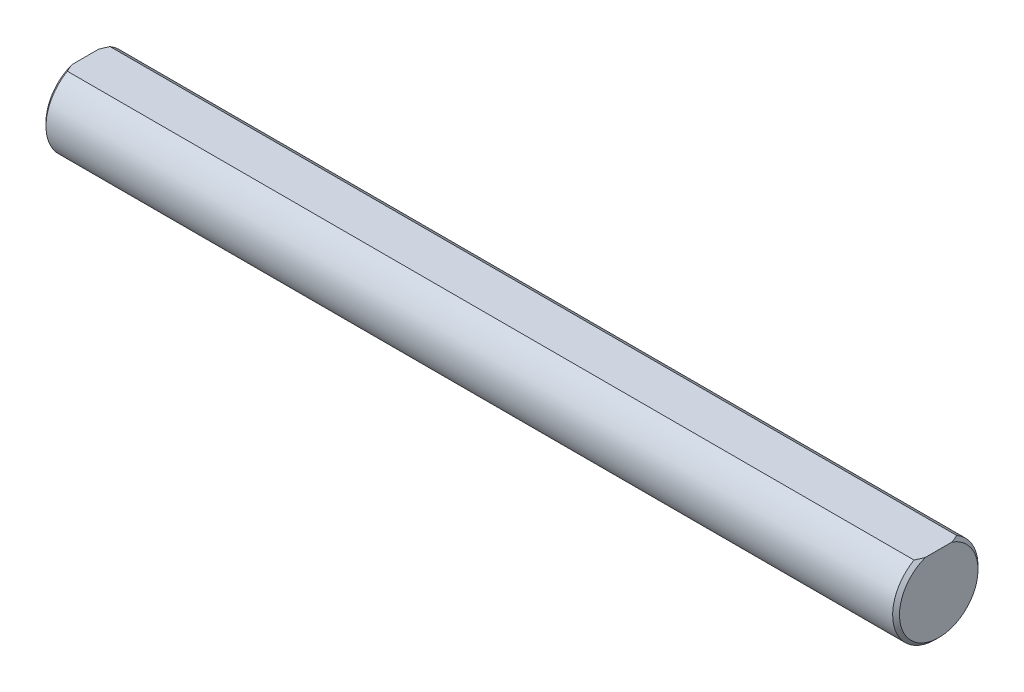
ISO-10303-21;
HEADER;
FILE_DESCRIPTION(('STEP AP214'),'2;1');
FILE_NAME('part.step','',(''),(''),'','','');
FILE_SCHEMA(('AUTOMOTIVE_DESIGN { 1 0 10303 214 1 1 1 1 }'));
ENDSEC;
DATA;
#1=APPLICATION_CONTEXT('core data for automotive mechanical design processes');
#2=APPLICATION_PROTOCOL_DEFINITION('international standard','automotive_design',2000,#1);
#3=PRODUCT_CONTEXT('',#1,'mechanical');
#4=PRODUCT('Part','Part','',(#3));
#5=PRODUCT_RELATED_PRODUCT_CATEGORY('part','',(#4));
#6=PRODUCT_DEFINITION_FORMATION('','',#4);
#7=PRODUCT_DEFINITION_CONTEXT('part definition',#1,'design');
#8=PRODUCT_DEFINITION('design','',#6,#7);
#9=PRODUCT_DEFINITION_SHAPE('','',#8);
#10=(LENGTH_UNIT() NAMED_UNIT(*) SI_UNIT(.MILLI.,.METRE.));
#11=(NAMED_UNIT(*) PLANE_ANGLE_UNIT() SI_UNIT($,.RADIAN.));
#12=(NAMED_UNIT(*) SI_UNIT($,.STERADIAN.) SOLID_ANGLE_UNIT());
#13=UNCERTAINTY_MEASURE_WITH_UNIT(LENGTH_MEASURE(1.E-05),#10,'distance_accuracy_value','');
#14=(GEOMETRIC_REPRESENTATION_CONTEXT(3) GLOBAL_UNCERTAINTY_ASSIGNED_CONTEXT((#13)) GLOBAL_UNIT_ASSIGNED_CONTEXT((#10,
#11,#12)) REPRESENTATION_CONTEXT('',''));
#15=CARTESIAN_POINT('',(0.,0.,0.));
#16=DIRECTION('',(0.,0.,1.));
#17=DIRECTION('',(1.,0.,0.));
#18=AXIS2_PLACEMENT_3D('',#15,#16,#17);
#19=CARTESIAN_POINT('',(63.5,0.,0.));
#20=DIRECTION('',(-1.,0.,0.));
#21=DIRECTION('',(0.,0.,-1.));
#22=AXIS2_PLACEMENT_3D('',#19,#20,#21);
#23=CYLINDRICAL_SURFACE('',#22,3.175);
#24=CARTESIAN_POINT('',(63.246,0.,0.));
#25=DIRECTION('',(-1.,0.,0.));
#26=DIRECTION('',(0.,0.,1.));
#27=AXIS2_PLACEMENT_3D('',#24,#25,#26);
#28=CIRCLE('',#27,3.175);
#29=CARTESIAN_POINT('',(63.246,2.74963065701559,1.5875));
#30=VERTEX_POINT('',#29);
#31=CARTESIAN_POINT('',(63.246,2.74963065701559,-1.5875));
#32=VERTEX_POINT('',#31);
#33=EDGE_CURVE('E102',#30,#32,#28,.F.);
#34=ORIENTED_EDGE('',*,*,#33,.F.);
#35=DIRECTION('',(1.,0.,0.));
#36=VECTOR('',#35,1.);
#37=CARTESIAN_POINT('',(0.,2.74963065701559,1.5875));
#38=LINE('',#37,#36);
#39=CARTESIAN_POINT('',(0.25399999999999,2.74963065701559,1.5875));
#40=VERTEX_POINT('',#39);
#41=EDGE_CURVE('E114',#40,#30,#38,.T.);
#42=ORIENTED_EDGE('',*,*,#41,.F.);
#43=CARTESIAN_POINT('',(0.25399999999999,0.,0.));
#44=DIRECTION('',(-1.,0.,0.));
#45=DIRECTION('',(0.,0.,1.));
#46=AXIS2_PLACEMENT_3D('',#43,#44,#45);
#47=CIRCLE('',#46,3.175);
#48=CARTESIAN_POINT('',(0.25399999999999,2.74963065701559,-1.5875));
#49=VERTEX_POINT('',#48);
#50=EDGE_CURVE('E93',#49,#40,#47,.T.);
#51=ORIENTED_EDGE('',*,*,#50,.F.);
#52=DIRECTION('',(1.,0.,0.));
#53=VECTOR('',#52,1.);
#54=CARTESIAN_POINT('',(0.,2.74963065701559,-1.5875));
#55=LINE('',#54,#53);
#56=EDGE_CURVE('E98',#49,#32,#55,.T.);
#57=ORIENTED_EDGE('',*,*,#56,.T.);
#58=EDGE_LOOP('',(#34,#42,#51,#57));
#59=FACE_BOUND('',#58,.T.);
#60=ADVANCED_FACE('F43',(#59),#23,.T.);
#61=CARTESIAN_POINT('',(63.5,0.,0.));
#62=DIRECTION('',(1.,0.,0.));
#63=DIRECTION('',(0.,0.,1.));
#64=AXIS2_PLACEMENT_3D('',#61,#62,#63);
#65=PLANE('',#64);
#66=DIRECTION('',(0.,0.,1.));
#67=VECTOR('',#66,1.);
#68=CARTESIAN_POINT('',(63.5,2.74963065701559,-1.5875));
#69=LINE('',#68,#67);
#70=CARTESIAN_POINT('',(63.5,2.74963065701559,-0.98578509321245));
#71=VERTEX_POINT('',#70);
#72=CARTESIAN_POINT('',(63.5,2.74963065701559,0.98578509321245));
#73=VERTEX_POINT('',#72);
#74=EDGE_CURVE('E99',#71,#73,#69,.T.);
#75=ORIENTED_EDGE('',*,*,#74,.T.);
#76=CARTESIAN_POINT('',(63.5,0.,0.));
#77=DIRECTION('',(-1.,0.,0.));
#78=DIRECTION('',(0.,0.,1.));
#79=AXIS2_PLACEMENT_3D('',#76,#77,#78);
#80=CIRCLE('',#79,2.92099999999998);
#81=EDGE_CURVE('E106',#71,#73,#80,.T.);
#82=ORIENTED_EDGE('',*,*,#81,.F.);
#83=EDGE_LOOP('',(#75,#82));
#84=FACE_BOUND('',#83,.T.);
#85=ADVANCED_FACE('F124',(#84),#65,.T.);
#86=CARTESIAN_POINT('',(0.,0.,0.));
#87=DIRECTION('',(1.,0.,0.));
#88=DIRECTION('',(0.,0.,1.));
#89=AXIS2_PLACEMENT_3D('',#86,#87,#88);
#90=PLANE('',#89);
#91=CARTESIAN_POINT('',(0.,0.,0.));
#92=DIRECTION('',(-1.,0.,0.));
#93=DIRECTION('',(0.,0.,1.));
#94=AXIS2_PLACEMENT_3D('',#91,#92,#93);
#95=CIRCLE('',#94,2.92100000000001);
#96=CARTESIAN_POINT('',(0.,2.74963065701559,0.985785093212533));
#97=VERTEX_POINT('',#96);
#98=CARTESIAN_POINT('',(0.,2.74963065701559,-0.985785093212533));
#99=VERTEX_POINT('',#98);
#100=EDGE_CURVE('E91',#97,#99,#95,.F.);
#101=ORIENTED_EDGE('',*,*,#100,.F.);
#102=DIRECTION('',(0.,0.,1.));
#103=VECTOR('',#102,1.);
#104=CARTESIAN_POINT('',(0.,2.74963065701559,-1.5875));
#105=LINE('',#104,#103);
#106=EDGE_CURVE('E95',#99,#97,#105,.T.);
#107=ORIENTED_EDGE('',*,*,#106,.F.);
#108=EDGE_LOOP('',(#101,#107));
#109=FACE_BOUND('',#108,.T.);
#110=ADVANCED_FACE('F101',(#109),#90,.F.);
#111=CARTESIAN_POINT('',(63.5,0.,0.));
#112=DIRECTION('',(-1.,0.,0.));
#113=DIRECTION('',(0.,0.,-1.));
#114=AXIS2_PLACEMENT_3D('',#111,#112,#113);
#115=CONICAL_SURFACE('',#114,2.92099999999998,0.785398163397426);
#116=CARTESIAN_POINT('',(63.2456499421323,2.74963065701559,-1.5882));
#117=CARTESIAN_POINT('',(63.3001996989638,2.74963065701559,-1.47903148983546));
#118=CARTESIAN_POINT('',(63.3515467736487,2.74963065701559,-1.36803725312433));
#119=CARTESIAN_POINT('',(63.4455640164844,2.74963065701559,-1.14170613856966));
#120=CARTESIAN_POINT('',(63.4881818395587,2.74963065701559,-1.02634771127011));
#121=CARTESIAN_POINT('',(63.561188105863,2.74963065701559,-0.793732645811769));
#122=CARTESIAN_POINT('',(63.5917601474436,2.74963065701559,-0.676535314799173));
#123=CARTESIAN_POINT('',(63.6388637626289,2.74963065701559,-0.439559207905062));
#124=CARTESIAN_POINT('',(63.6554305251547,2.74963065701559,-0.319787681762728));
#125=CARTESIAN_POINT('',(63.6703772767312,2.74963065701559,-0.113390763403446));
#126=CARTESIAN_POINT('',(63.6725911723138,2.74963065701559,-0.0270323810888239));
#127=CARTESIAN_POINT('',(63.6688706827955,2.74963065701559,0.145543469555141));
#128=CARTESIAN_POINT('',(63.6629334400268,2.74963065701559,0.231760877849797));
#129=CARTESIAN_POINT('',(63.643248527632,2.74963065701559,0.403381872739535));
#130=CARTESIAN_POINT('',(63.6294921121184,2.74963065701559,0.48878443897258));
#131=CARTESIAN_POINT('',(63.5949240312319,2.74963065701559,0.658112847485047));
#132=CARTESIAN_POINT('',(63.5741129063332,2.74963065701559,0.742038802372403));
#133=CARTESIAN_POINT('',(63.51230417238,2.74963065701559,0.957097052575754));
#134=CARTESIAN_POINT('',(63.4666386107287,2.74963065701559,1.08689353852323));
#135=CARTESIAN_POINT('',(63.389545010794,2.74963065701559,1.27774543186099));
#136=CARTESIAN_POINT('',(63.362457262408,2.74963065701559,1.3406393035772));
#137=CARTESIAN_POINT('',(63.3058118782309,2.74963065701559,1.46526121960738));
#138=CARTESIAN_POINT('',(63.2762557633007,2.74963065701559,1.52698995347894));
#139=CARTESIAN_POINT('',(63.2456499421323,2.74963065701559,1.5882));
#140=B_SPLINE_CURVE_WITH_KNOTS('',3,(#116,#117,#118,#119,#120,#121,#122,#123,#124,#125,#126,
#127,#128,#129,#130,#131,#132,#133,#134,#135,#136,#137,#138,#139),.UNSPECIFIED.,.F.,.F.,(4,2,2,
2,2,2,2,2,2,2,2,4),(0.,0.366369811138796,0.734876090737462,1.09752564771275,1.45926129943158,
1.71805477031432,1.97693899350517,2.23611335485394,2.49526786486612,2.90718803562739,
3.11259006926562,3.31786646708285),.UNSPECIFIED.);
#141=EDGE_CURVE('E108',#32,#71,#140,.T.);
#142=ORIENTED_EDGE('',*,*,#141,.T.);
#143=ORIENTED_EDGE('',*,*,#81,.T.);
#144=EDGE_CURVE('E71',#73,#30,#140,.T.);
#145=ORIENTED_EDGE('',*,*,#144,.T.);
#146=ORIENTED_EDGE('',*,*,#33,.T.);
#147=EDGE_LOOP('',(#142,#143,#145,#146));
#148=FACE_BOUND('',#147,.T.);
#149=ADVANCED_FACE('F118',(#148),#115,.T.);
#150=CARTESIAN_POINT('',(0.25399999999999,0.,0.));
#151=DIRECTION('',(1.,0.,0.));
#152=DIRECTION('',(0.,0.,1.));
#153=AXIS2_PLACEMENT_3D('',#150,#151,#152);
#154=CONICAL_SURFACE('',#153,3.175,0.785398163397453);
#155=CARTESIAN_POINT('',(0.254350057867626,2.74963065701559,1.5882));
#156=CARTESIAN_POINT('',(0.199800301036159,2.74963065701559,1.47903148983545));
#157=CARTESIAN_POINT('',(0.148453226351223,2.74963065701559,1.36803725312432));
#158=CARTESIAN_POINT('',(0.0544359835155347,2.74963065701559,1.14170613856963));
#159=CARTESIAN_POINT('',(0.0118181604412173,2.74963065701559,1.02634771127008));
#160=CARTESIAN_POINT('',(-0.0611881058630364,2.74963065701559,0.793732645811729));
#161=CARTESIAN_POINT('',(-0.0917601474436554,2.74963065701559,0.676535314799128));
#162=CARTESIAN_POINT('',(-0.138863762628965,2.74963065701559,0.439559207905006));
#163=CARTESIAN_POINT('',(-0.155430525154702,2.74963065701559,0.319787681762666));
#164=CARTESIAN_POINT('',(-0.170377276731224,2.74963065701559,0.113390763403372));
#165=CARTESIAN_POINT('',(-0.172591172313852,2.74963065701559,0.0270323810887437));
#166=CARTESIAN_POINT('',(-0.168870682795494,2.74963065701559,-0.145543469555233));
#167=CARTESIAN_POINT('',(-0.162933440026837,2.74963065701559,-0.231760877849895));
#168=CARTESIAN_POINT('',(-0.143248527631991,2.74963065701559,-0.403381872739644));
#169=CARTESIAN_POINT('',(-0.129492112118363,2.74963065701559,-0.488784438972694));
#170=CARTESIAN_POINT('',(-0.0949240312318751,2.74963065701559,-0.658112847485173));
#171=CARTESIAN_POINT('',(-0.0741129063332185,2.74963065701559,-0.742038802372535));
#172=CARTESIAN_POINT('',(-0.0123041723800454,2.74963065701559,-0.957097052575866));
#173=CARTESIAN_POINT('',(0.0333613892713522,2.74963065701559,-1.08689353852331));
#174=CARTESIAN_POINT('',(0.110454989206009,2.74963065701559,-1.27774543186104));
#175=CARTESIAN_POINT('',(0.137542737592001,2.74963065701559,-1.34063930357724));
#176=CARTESIAN_POINT('',(0.194188121769084,2.74963065701559,-1.4652612196074));
#177=CARTESIAN_POINT('',(0.223744236699275,2.74963065701559,-1.52698995347895));
#178=CARTESIAN_POINT('',(0.254350057867626,2.74963065701559,-1.5882));
#179=B_SPLINE_CURVE_WITH_KNOTS('',3,(#155,#156,#157,#158,#159,#160,#161,#162,#163,#164,#165,
#166,#167,#168,#169,#170,#171,#172,#173,#174,#175,#176,#177,#178),.UNSPECIFIED.,.F.,.F.,(4,2,2,
2,2,2,2,2,2,2,2,4),(0.,0.366369811138813,0.734876090737489,1.0975256477128,1.45926129943164,
1.7180547703144,1.97693899350526,2.23611335485405,2.49526786486626,2.90718803562744,
3.11259006926564,3.31786646708284),.UNSPECIFIED.);
#180=EDGE_CURVE('E11',#40,#97,#179,.T.);
#181=ORIENTED_EDGE('',*,*,#180,.T.);
#182=ORIENTED_EDGE('',*,*,#100,.T.);
#183=EDGE_CURVE('E48',#99,#49,#179,.T.);
#184=ORIENTED_EDGE('',*,*,#183,.T.);
#185=ORIENTED_EDGE('',*,*,#50,.T.);
#186=EDGE_LOOP('',(#181,#182,#184,#185));
#187=FACE_BOUND('',#186,.T.);
#188=ADVANCED_FACE('F45',(#187),#154,.T.);
#189=CARTESIAN_POINT('',(0.,2.74963065701559,-1.5875));
#190=DIRECTION('',(0.,-1.,0.));
#191=DIRECTION('',(0.,0.,1.));
#192=AXIS2_PLACEMENT_3D('',#189,#190,#191);
#193=PLANE('',#192);
#194=ORIENTED_EDGE('',*,*,#141,.F.);
#195=ORIENTED_EDGE('',*,*,#56,.F.);
#196=ORIENTED_EDGE('',*,*,#183,.F.);
#197=ORIENTED_EDGE('',*,*,#106,.T.);
#198=ORIENTED_EDGE('',*,*,#180,.F.);
#199=ORIENTED_EDGE('',*,*,#41,.T.);
#200=ORIENTED_EDGE('',*,*,#144,.F.);
#201=ORIENTED_EDGE('',*,*,#74,.F.);
#202=EDGE_LOOP('',(#194,#195,#196,#197,#198,#199,#200,#201));
#203=FACE_BOUND('',#202,.T.);
#204=ADVANCED_FACE('F96',(#203),#193,.F.);
#205=CLOSED_SHELL('',(#60,#85,#110,#149,#188,#204));
#206=MANIFOLD_SOLID_BREP('B2',#205);
#207=ADVANCED_BREP_SHAPE_REPRESENTATION('',(#18,#206),#14);
#208=SHAPE_DEFINITION_REPRESENTATION(#9,#207);
ENDSEC;
END-ISO-10303-21;
